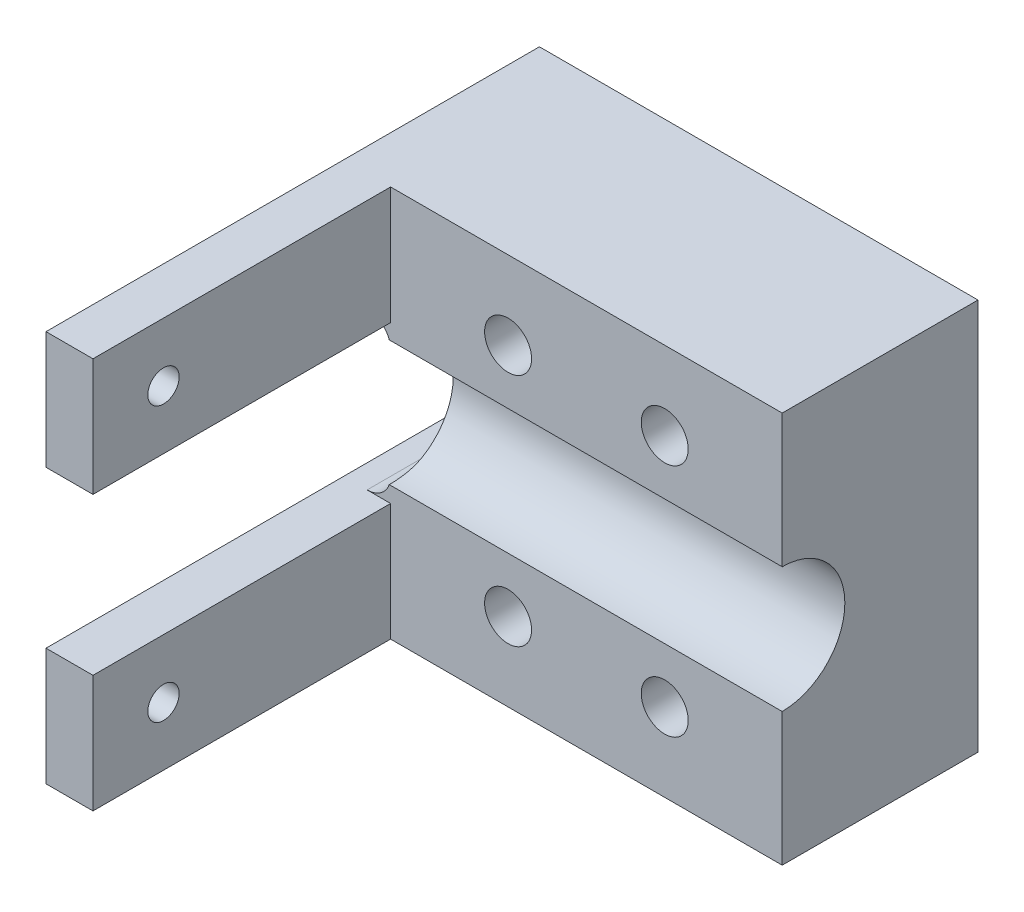
ISO-10303-21;
HEADER;
FILE_DESCRIPTION(('STEP AP214'),'2;1');
FILE_NAME('part.step','',(''),(''),'','','');
FILE_SCHEMA(('AUTOMOTIVE_DESIGN { 1 0 10303 214 1 1 1 1 }'));
ENDSEC;
DATA;
#1=APPLICATION_CONTEXT('core data for automotive mechanical design processes');
#2=APPLICATION_PROTOCOL_DEFINITION('international standard','automotive_design',2000,#1);
#3=PRODUCT_CONTEXT('',#1,'mechanical');
#4=PRODUCT('Part','Part','',(#3));
#5=PRODUCT_RELATED_PRODUCT_CATEGORY('part','',(#4));
#6=PRODUCT_DEFINITION_FORMATION('','',#4);
#7=PRODUCT_DEFINITION_CONTEXT('part definition',#1,'design');
#8=PRODUCT_DEFINITION('design','',#6,#7);
#9=PRODUCT_DEFINITION_SHAPE('','',#8);
#10=(LENGTH_UNIT() NAMED_UNIT(*) SI_UNIT(.MILLI.,.METRE.));
#11=(NAMED_UNIT(*) PLANE_ANGLE_UNIT() SI_UNIT($,.RADIAN.));
#12=(NAMED_UNIT(*) SI_UNIT($,.STERADIAN.) SOLID_ANGLE_UNIT());
#13=UNCERTAINTY_MEASURE_WITH_UNIT(LENGTH_MEASURE(1.E-05),#10,'distance_accuracy_value','');
#14=(GEOMETRIC_REPRESENTATION_CONTEXT(3) GLOBAL_UNCERTAINTY_ASSIGNED_CONTEXT((#13)) GLOBAL_UNIT_ASSIGNED_CONTEXT((#10,
#11,#12)) REPRESENTATION_CONTEXT('',''));
#15=CARTESIAN_POINT('',(0.,0.,0.));
#16=DIRECTION('',(0.,0.,1.));
#17=DIRECTION('',(1.,0.,0.));
#18=AXIS2_PLACEMENT_3D('',#15,#16,#17);
#19=CARTESIAN_POINT('',(0.,0.,25.));
#20=DIRECTION('',(1.,0.,0.));
#21=DIRECTION('',(0.,0.,-1.));
#22=AXIS2_PLACEMENT_3D('',#19,#20,#21);
#23=PLANE('',#22);
#24=DIRECTION('',(0.,-1.,0.));
#25=VECTOR('',#24,1.);
#26=CARTESIAN_POINT('',(0.,0.,0.));
#27=LINE('',#26,#25);
#28=CARTESIAN_POINT('',(0.,32.,0.));
#29=VERTEX_POINT('',#28);
#30=CARTESIAN_POINT('',(0.,18.,0.));
#31=VERTEX_POINT('',#30);
#32=EDGE_CURVE('E158',#29,#31,#27,.T.);
#33=ORIENTED_EDGE('',*,*,#32,.T.);
#34=DIRECTION('',(0.,0.,-1.));
#35=VECTOR('',#34,1.);
#36=CARTESIAN_POINT('',(0.,18.,25.));
#37=LINE('',#36,#35);
#38=CARTESIAN_POINT('',(0.,18.,21.1270166537926));
#39=VERTEX_POINT('',#38);
#40=EDGE_CURVE('E292',#31,#39,#37,.F.);
#41=ORIENTED_EDGE('',*,*,#40,.T.);
#42=CARTESIAN_POINT('',(0.,25.,25.));
#43=DIRECTION('',(-1.,0.,0.));
#44=DIRECTION('',(0.,0.,1.));
#45=AXIS2_PLACEMENT_3D('',#42,#43,#44);
#46=CIRCLE('',#45,8.);
#47=CARTESIAN_POINT('',(0.,32.,21.1270166537926));
#48=VERTEX_POINT('',#47);
#49=EDGE_CURVE('E242',#48,#39,#46,.T.);
#50=ORIENTED_EDGE('',*,*,#49,.F.);
#51=DIRECTION('',(0.,0.,1.));
#52=VECTOR('',#51,1.);
#53=CARTESIAN_POINT('',(0.,32.,0.));
#54=LINE('',#53,#52);
#55=EDGE_CURVE('E290',#48,#29,#54,.F.);
#56=ORIENTED_EDGE('',*,*,#55,.T.);
#57=EDGE_LOOP('',(#33,#41,#50,#56));
#58=FACE_BOUND('',#57,.T.);
#59=ADVANCED_FACE('F33',(#58),#23,.F.);
#60=CARTESIAN_POINT('',(0.,0.,25.));
#61=DIRECTION('',(0.,0.,-1.));
#62=DIRECTION('',(-1.,0.,0.));
#63=AXIS2_PLACEMENT_3D('',#60,#61,#62);
#64=PLANE('',#63);
#65=CARTESIAN_POINT('',(35.,10.,25.));
#66=DIRECTION('',(0.,0.,1.));
#67=DIRECTION('',(1.,0.,0.));
#68=AXIS2_PLACEMENT_3D('',#65,#66,#67);
#69=CIRCLE('',#68,3.);
#70=CARTESIAN_POINT('',(38.,10.,25.));
#71=VERTEX_POINT('',#70);
#72=EDGE_CURVE('E231',#71,#71,#69,.T.);
#73=ORIENTED_EDGE('',*,*,#72,.F.);
#74=EDGE_LOOP('',(#73));
#75=FACE_BOUND('',#74,.T.);
#76=CARTESIAN_POINT('',(15.,10.,25.));
#77=DIRECTION('',(0.,0.,1.));
#78=DIRECTION('',(1.,0.,0.));
#79=AXIS2_PLACEMENT_3D('',#76,#77,#78);
#80=CIRCLE('',#79,3.);
#81=CARTESIAN_POINT('',(18.,10.,25.));
#82=VERTEX_POINT('',#81);
#83=EDGE_CURVE('E220',#82,#82,#80,.T.);
#84=ORIENTED_EDGE('',*,*,#83,.F.);
#85=EDGE_LOOP('',(#84));
#86=FACE_BOUND('',#85,.T.);
#87=DIRECTION('',(0.,1.,0.));
#88=VECTOR('',#87,1.);
#89=CARTESIAN_POINT('',(50.,0.,25.));
#90=LINE('',#89,#88);
#91=CARTESIAN_POINT('',(50.,0.,25.));
#92=VERTEX_POINT('',#91);
#93=CARTESIAN_POINT('',(50.,17.,25.));
#94=VERTEX_POINT('',#93);
#95=EDGE_CURVE('E257',#92,#94,#90,.T.);
#96=ORIENTED_EDGE('',*,*,#95,.T.);
#97=DIRECTION('',(-1.,0.,0.));
#98=VECTOR('',#97,1.);
#99=CARTESIAN_POINT('',(58.,17.,25.));
#100=LINE('',#99,#98);
#101=CARTESIAN_POINT('',(-0.171572875253753,17.,25.));
#102=VERTEX_POINT('',#101);
#103=EDGE_CURVE('E272',#94,#102,#100,.T.);
#104=ORIENTED_EDGE('',*,*,#103,.T.);
#105=CARTESIAN_POINT('',(-3.,18.,25.));
#106=DIRECTION('',(0.,0.,-1.));
#107=DIRECTION('',(-1.,0.,0.));
#108=AXIS2_PLACEMENT_3D('',#105,#106,#107);
#109=CIRCLE('',#108,3.);
#110=CARTESIAN_POINT('',(-3.,15.,25.));
#111=VERTEX_POINT('',#110);
#112=EDGE_CURVE('E308',#102,#111,#109,.T.);
#113=ORIENTED_EDGE('',*,*,#112,.T.);
#114=DIRECTION('',(-1.,0.,0.));
#115=VECTOR('',#114,1.);
#116=CARTESIAN_POINT('',(0.,15.,25.));
#117=LINE('',#116,#115);
#118=CARTESIAN_POINT('',(0.,15.,25.));
#119=VERTEX_POINT('',#118);
#120=EDGE_CURVE('E57',#119,#111,#117,.T.);
#121=ORIENTED_EDGE('',*,*,#120,.F.);
#122=DIRECTION('',(0.,-1.,0.));
#123=VECTOR('',#122,1.);
#124=CARTESIAN_POINT('',(0.,0.,25.));
#125=LINE('',#124,#123);
#126=CARTESIAN_POINT('',(0.,0.,25.));
#127=VERTEX_POINT('',#126);
#128=EDGE_CURVE('E192',#119,#127,#125,.T.);
#129=ORIENTED_EDGE('',*,*,#128,.T.);
#130=DIRECTION('',(1.,0.,0.));
#131=VECTOR('',#130,1.);
#132=CARTESIAN_POINT('',(0.,0.,25.));
#133=LINE('',#132,#131);
#134=EDGE_CURVE('E253',#127,#92,#133,.T.);
#135=ORIENTED_EDGE('',*,*,#134,.T.);
#136=EDGE_LOOP('',(#96,#104,#113,#121,#129,#135));
#137=FACE_BOUND('',#136,.T.);
#138=ADVANCED_FACE('F330',(#75,#86,#137),#64,.F.);
#139=CARTESIAN_POINT('',(0.,0.,25.));
#140=DIRECTION('',(0.,1.,0.));
#141=DIRECTION('',(0.,0.,1.));
#142=AXIS2_PLACEMENT_3D('',#139,#140,#141);
#143=PLANE('',#142);
#144=DIRECTION('',(1.,0.,0.));
#145=VECTOR('',#144,1.);
#146=CARTESIAN_POINT('',(0.,0.,0.));
#147=LINE('',#146,#145);
#148=CARTESIAN_POINT('',(-6.,0.,0.));
#149=VERTEX_POINT('',#148);
#150=CARTESIAN_POINT('',(50.,0.,0.));
#151=VERTEX_POINT('',#150);
#152=EDGE_CURVE('E146',#149,#151,#147,.T.);
#153=ORIENTED_EDGE('',*,*,#152,.T.);
#154=DIRECTION('',(0.,0.,-1.));
#155=VECTOR('',#154,1.);
#156=CARTESIAN_POINT('',(50.,0.,25.));
#157=LINE('',#156,#155);
#158=EDGE_CURVE('E269',#92,#151,#157,.T.);
#159=ORIENTED_EDGE('',*,*,#158,.F.);
#160=ORIENTED_EDGE('',*,*,#134,.F.);
#161=DIRECTION('',(0.,0.,1.));
#162=VECTOR('',#161,1.);
#163=CARTESIAN_POINT('',(0.,0.,0.));
#164=LINE('',#163,#162);
#165=CARTESIAN_POINT('',(0.,0.,63.));
#166=VERTEX_POINT('',#165);
#167=EDGE_CURVE('E184',#127,#166,#164,.T.);
#168=ORIENTED_EDGE('',*,*,#167,.T.);
#169=DIRECTION('',(1.,0.,0.));
#170=VECTOR('',#169,1.);
#171=CARTESIAN_POINT('',(-6.,0.,63.));
#172=LINE('',#171,#170);
#173=CARTESIAN_POINT('',(-6.,0.,63.));
#174=VERTEX_POINT('',#173);
#175=EDGE_CURVE('E164',#174,#166,#172,.T.);
#176=ORIENTED_EDGE('',*,*,#175,.F.);
#177=DIRECTION('',(0.,0.,1.));
#178=VECTOR('',#177,1.);
#179=CARTESIAN_POINT('',(-6.,0.,0.));
#180=LINE('',#179,#178);
#181=EDGE_CURVE('E161',#149,#174,#180,.T.);
#182=ORIENTED_EDGE('',*,*,#181,.F.);
#183=EDGE_LOOP('',(#153,#159,#160,#168,#176,#182));
#184=FACE_BOUND('',#183,.T.);
#185=ADVANCED_FACE('F162',(#184),#143,.F.);
#186=CARTESIAN_POINT('',(50.,0.,25.));
#187=DIRECTION('',(-1.,0.,0.));
#188=DIRECTION('',(0.,0.,1.));
#189=AXIS2_PLACEMENT_3D('',#186,#187,#188);
#190=PLANE('',#189);
#191=CARTESIAN_POINT('',(50.,33.,25.));
#192=VERTEX_POINT('',#191);
#193=CARTESIAN_POINT('',(50.,50.,25.));
#194=VERTEX_POINT('',#193);
#195=EDGE_CURVE('E256',#192,#194,#90,.T.);
#196=ORIENTED_EDGE('',*,*,#195,.F.);
#197=CARTESIAN_POINT('',(50.,25.,25.));
#198=DIRECTION('',(-1.,0.,0.));
#199=DIRECTION('',(0.,0.,1.));
#200=AXIS2_PLACEMENT_3D('',#197,#198,#199);
#201=CIRCLE('',#200,8.);
#202=EDGE_CURVE('E247',#192,#94,#201,.T.);
#203=ORIENTED_EDGE('',*,*,#202,.T.);
#204=ORIENTED_EDGE('',*,*,#95,.F.);
#205=ORIENTED_EDGE('',*,*,#158,.T.);
#206=DIRECTION('',(0.,1.,0.));
#207=VECTOR('',#206,1.);
#208=CARTESIAN_POINT('',(50.,0.,0.));
#209=LINE('',#208,#207);
#210=CARTESIAN_POINT('',(50.,50.,0.));
#211=VERTEX_POINT('',#210);
#212=EDGE_CURVE('E154',#151,#211,#209,.T.);
#213=ORIENTED_EDGE('',*,*,#212,.T.);
#214=DIRECTION('',(0.,0.,-1.));
#215=VECTOR('',#214,1.);
#216=CARTESIAN_POINT('',(50.,50.,25.));
#217=LINE('',#216,#215);
#218=EDGE_CURVE('E262',#194,#211,#217,.T.);
#219=ORIENTED_EDGE('',*,*,#218,.F.);
#220=EDGE_LOOP('',(#196,#203,#204,#205,#213,#219));
#221=FACE_BOUND('',#220,.T.);
#222=ADVANCED_FACE('F334',(#221),#190,.F.);
#223=CARTESIAN_POINT('',(0.,50.,25.));
#224=DIRECTION('',(0.,-1.,0.));
#225=DIRECTION('',(0.,0.,-1.));
#226=AXIS2_PLACEMENT_3D('',#223,#224,#225);
#227=PLANE('',#226);
#228=DIRECTION('',(-1.,0.,0.));
#229=VECTOR('',#228,1.);
#230=CARTESIAN_POINT('',(0.,50.,0.));
#231=LINE('',#230,#229);
#232=CARTESIAN_POINT('',(-6.,50.,0.));
#233=VERTEX_POINT('',#232);
#234=EDGE_CURVE('E254',#211,#233,#231,.T.);
#235=ORIENTED_EDGE('',*,*,#234,.T.);
#236=DIRECTION('',(0.,0.,-1.));
#237=VECTOR('',#236,1.);
#238=CARTESIAN_POINT('',(-6.,50.,0.));
#239=LINE('',#238,#237);
#240=CARTESIAN_POINT('',(-6.,50.,63.));
#241=VERTEX_POINT('',#240);
#242=EDGE_CURVE('E203',#241,#233,#239,.T.);
#243=ORIENTED_EDGE('',*,*,#242,.F.);
#244=DIRECTION('',(1.,0.,0.));
#245=VECTOR('',#244,1.);
#246=CARTESIAN_POINT('',(-6.,50.,63.));
#247=LINE('',#246,#245);
#248=CARTESIAN_POINT('',(0.,50.,63.));
#249=VERTEX_POINT('',#248);
#250=EDGE_CURVE('E206',#241,#249,#247,.T.);
#251=ORIENTED_EDGE('',*,*,#250,.T.);
#252=DIRECTION('',(0.,0.,-1.));
#253=VECTOR('',#252,1.);
#254=CARTESIAN_POINT('',(0.,50.,0.));
#255=LINE('',#254,#253);
#256=CARTESIAN_POINT('',(0.,50.,25.));
#257=VERTEX_POINT('',#256);
#258=EDGE_CURVE('E199',#249,#257,#255,.T.);
#259=ORIENTED_EDGE('',*,*,#258,.T.);
#260=DIRECTION('',(-1.,0.,0.));
#261=VECTOR('',#260,1.);
#262=CARTESIAN_POINT('',(0.,50.,25.));
#263=LINE('',#262,#261);
#264=EDGE_CURVE('E260',#194,#257,#263,.T.);
#265=ORIENTED_EDGE('',*,*,#264,.F.);
#266=ORIENTED_EDGE('',*,*,#218,.T.);
#267=EDGE_LOOP('',(#235,#243,#251,#259,#265,#266));
#268=FACE_BOUND('',#267,.T.);
#269=ADVANCED_FACE('F337',(#268),#227,.F.);
#270=CARTESIAN_POINT('',(35.,40.,25.));
#271=DIRECTION('',(0.,0.,1.));
#272=DIRECTION('',(1.,0.,0.));
#273=AXIS2_PLACEMENT_3D('',#270,#271,#272);
#274=CIRCLE('',#273,3.);
#275=CARTESIAN_POINT('',(38.,40.,25.));
#276=VERTEX_POINT('',#275);
#277=EDGE_CURVE('E225',#276,#276,#274,.T.);
#278=ORIENTED_EDGE('',*,*,#277,.F.);
#279=EDGE_LOOP('',(#278));
#280=FACE_BOUND('',#279,.T.);
#281=CARTESIAN_POINT('',(15.,40.,25.));
#282=DIRECTION('',(0.,0.,1.));
#283=DIRECTION('',(1.,0.,0.));
#284=AXIS2_PLACEMENT_3D('',#281,#282,#283);
#285=CIRCLE('',#284,3.);
#286=CARTESIAN_POINT('',(18.,40.,25.));
#287=VERTEX_POINT('',#286);
#288=EDGE_CURVE('E224',#287,#287,#285,.T.);
#289=ORIENTED_EDGE('',*,*,#288,.F.);
#290=EDGE_LOOP('',(#289));
#291=FACE_BOUND('',#290,.T.);
#292=DIRECTION('',(0.,-1.,0.));
#293=VECTOR('',#292,1.);
#294=CARTESIAN_POINT('',(0.,0.,25.));
#295=LINE('',#294,#293);
#296=CARTESIAN_POINT('',(0.,35.,25.));
#297=VERTEX_POINT('',#296);
#298=EDGE_CURVE('E250',#257,#297,#295,.T.);
#299=ORIENTED_EDGE('',*,*,#298,.T.);
#300=DIRECTION('',(1.,0.,0.));
#301=VECTOR('',#300,1.);
#302=CARTESIAN_POINT('',(0.,35.,25.));
#303=LINE('',#302,#301);
#304=CARTESIAN_POINT('',(-3.,35.,25.));
#305=VERTEX_POINT('',#304);
#306=EDGE_CURVE('E294',#305,#297,#303,.T.);
#307=ORIENTED_EDGE('',*,*,#306,.F.);
#308=CARTESIAN_POINT('',(-3.,32.,25.));
#309=DIRECTION('',(0.,0.,-1.));
#310=DIRECTION('',(-1.,0.,0.));
#311=AXIS2_PLACEMENT_3D('',#308,#309,#310);
#312=CIRCLE('',#311,3.);
#313=CARTESIAN_POINT('',(-0.171572875253753,33.,25.));
#314=VERTEX_POINT('',#313);
#315=EDGE_CURVE('E365',#305,#314,#312,.T.);
#316=ORIENTED_EDGE('',*,*,#315,.T.);
#317=DIRECTION('',(-1.,0.,0.));
#318=VECTOR('',#317,1.);
#319=CARTESIAN_POINT('',(58.,33.,25.));
#320=LINE('',#319,#318);
#321=EDGE_CURVE('E49',#314,#192,#320,.F.);
#322=ORIENTED_EDGE('',*,*,#321,.T.);
#323=ORIENTED_EDGE('',*,*,#195,.T.);
#324=ORIENTED_EDGE('',*,*,#264,.T.);
#325=EDGE_LOOP('',(#299,#307,#316,#322,#323,#324));
#326=FACE_BOUND('',#325,.T.);
#327=ADVANCED_FACE('F341',(#280,#291,#326),#64,.F.);
#328=CARTESIAN_POINT('',(0.,0.,0.));
#329=DIRECTION('',(0.,0.,-1.));
#330=DIRECTION('',(-1.,0.,0.));
#331=AXIS2_PLACEMENT_3D('',#328,#329,#330);
#332=PLANE('',#331);
#333=CARTESIAN_POINT('',(35.,40.,0.));
#334=DIRECTION('',(0.,0.,1.));
#335=DIRECTION('',(1.,0.,0.));
#336=AXIS2_PLACEMENT_3D('',#333,#334,#335);
#337=CIRCLE('',#336,3.);
#338=CARTESIAN_POINT('',(38.,40.,0.));
#339=VERTEX_POINT('',#338);
#340=EDGE_CURVE('E221',#339,#339,#337,.T.);
#341=ORIENTED_EDGE('',*,*,#340,.T.);
#342=EDGE_LOOP('',(#341));
#343=FACE_BOUND('',#342,.T.);
#344=CARTESIAN_POINT('',(35.,10.,0.));
#345=DIRECTION('',(0.,0.,1.));
#346=DIRECTION('',(1.,0.,0.));
#347=AXIS2_PLACEMENT_3D('',#344,#345,#346);
#348=CIRCLE('',#347,3.);
#349=CARTESIAN_POINT('',(38.,10.,0.));
#350=VERTEX_POINT('',#349);
#351=EDGE_CURVE('E228',#350,#350,#348,.T.);
#352=ORIENTED_EDGE('',*,*,#351,.T.);
#353=EDGE_LOOP('',(#352));
#354=FACE_BOUND('',#353,.T.);
#355=CARTESIAN_POINT('',(15.,10.,0.));
#356=DIRECTION('',(0.,0.,1.));
#357=DIRECTION('',(1.,0.,0.));
#358=AXIS2_PLACEMENT_3D('',#355,#356,#357);
#359=CIRCLE('',#358,3.);
#360=CARTESIAN_POINT('',(18.,10.,0.));
#361=VERTEX_POINT('',#360);
#362=EDGE_CURVE('E234',#361,#361,#359,.T.);
#363=ORIENTED_EDGE('',*,*,#362,.T.);
#364=EDGE_LOOP('',(#363));
#365=FACE_BOUND('',#364,.T.);
#366=CARTESIAN_POINT('',(15.,40.,0.));
#367=DIRECTION('',(0.,0.,1.));
#368=DIRECTION('',(1.,0.,0.));
#369=AXIS2_PLACEMENT_3D('',#366,#367,#368);
#370=CIRCLE('',#369,3.);
#371=CARTESIAN_POINT('',(18.,40.,0.));
#372=VERTEX_POINT('',#371);
#373=EDGE_CURVE('E239',#372,#372,#370,.T.);
#374=ORIENTED_EDGE('',*,*,#373,.T.);
#375=EDGE_LOOP('',(#374));
#376=FACE_BOUND('',#375,.T.);
#377=ORIENTED_EDGE('',*,*,#32,.F.);
#378=CARTESIAN_POINT('',(-3.,32.,0.));
#379=DIRECTION('',(0.,0.,-1.));
#380=DIRECTION('',(-1.,0.,0.));
#381=AXIS2_PLACEMENT_3D('',#378,#379,#380);
#382=CIRCLE('',#381,3.);
#383=CARTESIAN_POINT('',(-3.,35.,0.));
#384=VERTEX_POINT('',#383);
#385=EDGE_CURVE('E11',#29,#384,#382,.F.);
#386=ORIENTED_EDGE('',*,*,#385,.T.);
#387=DIRECTION('',(1.,0.,0.));
#388=VECTOR('',#387,1.);
#389=CARTESIAN_POINT('',(-6.,35.,0.));
#390=LINE('',#389,#388);
#391=CARTESIAN_POINT('',(-6.,35.,0.));
#392=VERTEX_POINT('',#391);
#393=EDGE_CURVE('E217',#392,#384,#390,.T.);
#394=ORIENTED_EDGE('',*,*,#393,.F.);
#395=DIRECTION('',(0.,-1.,0.));
#396=VECTOR('',#395,1.);
#397=CARTESIAN_POINT('',(-6.,50.,0.));
#398=LINE('',#397,#396);
#399=EDGE_CURVE('E195',#233,#392,#398,.T.);
#400=ORIENTED_EDGE('',*,*,#399,.F.);
#401=ORIENTED_EDGE('',*,*,#234,.F.);
#402=ORIENTED_EDGE('',*,*,#212,.F.);
#403=ORIENTED_EDGE('',*,*,#152,.F.);
#404=DIRECTION('',(0.,-1.,0.));
#405=VECTOR('',#404,1.);
#406=CARTESIAN_POINT('',(-6.,0.,0.));
#407=LINE('',#406,#405);
#408=CARTESIAN_POINT('',(-6.,15.,0.));
#409=VERTEX_POINT('',#408);
#410=EDGE_CURVE('E152',#409,#149,#407,.T.);
#411=ORIENTED_EDGE('',*,*,#410,.F.);
#412=DIRECTION('',(1.,0.,0.));
#413=VECTOR('',#412,1.);
#414=CARTESIAN_POINT('',(-6.,15.,0.));
#415=LINE('',#414,#413);
#416=CARTESIAN_POINT('',(-3.,15.,0.));
#417=VERTEX_POINT('',#416);
#418=EDGE_CURVE('E183',#409,#417,#415,.T.);
#419=ORIENTED_EDGE('',*,*,#418,.T.);
#420=CARTESIAN_POINT('',(-3.,18.,0.));
#421=DIRECTION('',(0.,0.,-1.));
#422=DIRECTION('',(-1.,0.,0.));
#423=AXIS2_PLACEMENT_3D('',#420,#421,#422);
#424=CIRCLE('',#423,3.);
#425=EDGE_CURVE('E299',#417,#31,#424,.F.);
#426=ORIENTED_EDGE('',*,*,#425,.T.);
#427=EDGE_LOOP('',(#377,#386,#394,#400,#401,#402,#403,#411,#419,#426));
#428=FACE_BOUND('',#427,.T.);
#429=ADVANCED_FACE('F149',(#343,#354,#365,#376,#428),#332,.T.);
#430=CARTESIAN_POINT('',(58.,25.,25.));
#431=DIRECTION('',(-1.,0.,0.));
#432=DIRECTION('',(0.,0.,1.));
#433=AXIS2_PLACEMENT_3D('',#430,#431,#432);
#434=CYLINDRICAL_SURFACE('',#433,8.);
#435=ORIENTED_EDGE('',*,*,#202,.F.);
#436=ORIENTED_EDGE('',*,*,#321,.F.);
#437=CARTESIAN_POINT('',(-0.171572875253754,33.,25.));
#438=CARTESIAN_POINT('',(-0.171585856309354,33.0000017938301,24.8910241534674));
#439=CARTESIAN_POINT('',(-0.170785940632372,32.9977733407256,24.7820505328427));
#440=CARTESIAN_POINT('',(-0.16765517047335,32.9888697958035,24.5643125449429));
#441=CARTESIAN_POINT('',(-0.165324395498762,32.9821949349164,24.4555481670947));
#442=CARTESIAN_POINT('',(-0.159227600972294,32.9644149288414,24.2384526547431));
#443=CARTESIAN_POINT('',(-0.155461985468793,32.9533110308208,24.1301214069413));
#444=CARTESIAN_POINT('',(-0.146682590205156,32.9267005554211,23.9140585551102));
#445=CARTESIAN_POINT('',(-0.14166880840112,32.9111939708324,23.8063269520631));
#446=CARTESIAN_POINT('',(-0.125323692714573,32.8588242125467,23.488601282518));
#447=CARTESIAN_POINT('',(-0.112546762343051,32.8157458997686,23.2796749270812));
#448=CARTESIAN_POINT('',(-0.0855000210889197,32.7130898915755,22.8660730100755));
#449=CARTESIAN_POINT('',(-0.0712305250383138,32.6535156713494,22.6613965629317));
#450=CARTESIAN_POINT('',(-0.0501348457834645,32.5475517790388,22.3450002620516));
#451=CARTESIAN_POINT('',(-0.0427639938388512,32.5066454510003,22.2314547255856));
#452=CARTESIAN_POINT('',(-0.029180631211498,32.419723520608,22.0062966399235));
#453=CARTESIAN_POINT('',(-0.0229677745996056,32.3737094506701,21.8946835225207));
#454=CARTESIAN_POINT('',(-0.0123211145800007,32.2760764977337,21.672294361909));
#455=CARTESIAN_POINT('',(-0.00790878959729857,32.2243987778035,21.5615430570541));
#456=CARTESIAN_POINT('',(-0.00175335642076239,32.1159721679458,21.3424185304123));
#457=CARTESIAN_POINT('',(-1.14133695660659E-05,32.059221075824,21.2340463670094));
#458=CARTESIAN_POINT('',(0.,32.,21.1270166537926));
#459=B_SPLINE_CURVE_WITH_KNOTS('',3,(#437,#438,#439,#440,#441,#442,#443,#444,#445,#446,#447,
#448,#449,#450,#451,#452,#453,#454,#455,#456,#457,#458),.UNSPECIFIED.,.F.,.F.,(4,2,2,2,2,2,2,2,
2,2,4),(0.,0.326897982472862,0.653778988355779,0.980568013111199,1.30735757299452,
1.9477220295443,2.58795168317563,2.95058313450154,3.31310608232063,3.67983531533284,
4.04672451436599),.UNSPECIFIED.);
#460=EDGE_CURVE('E42',#314,#48,#459,.T.);
#461=ORIENTED_EDGE('',*,*,#460,.T.);
#462=ORIENTED_EDGE('',*,*,#49,.T.);
#463=CARTESIAN_POINT('',(0.,18.,21.1270166537926));
#464=CARTESIAN_POINT('',(-5.76149416167776E-06,17.9480065585232,21.2209876588311));
#465=CARTESIAN_POINT('',(-0.00135088948546018,17.8979186130831,21.3159851789415));
#466=CARTESIAN_POINT('',(-0.00617617599810697,17.8016348413248,21.5078578691991));
#467=CARTESIAN_POINT('',(-0.00965591142956468,17.7554382457848,21.6047326635772));
#468=CARTESIAN_POINT('',(-0.0224796892595929,17.62280908697,21.8978963169583));
#469=CARTESIAN_POINT('',(-0.0342090877111769,17.5422997272146,22.0967921277532));
#470=CARTESIAN_POINT('',(-0.0599301109671954,17.3990169629137,22.4961684934119));
#471=CARTESIAN_POINT('',(-0.073871628195251,17.3359201332776,22.6965371961469));
#472=CARTESIAN_POINT('',(-0.101096532875535,17.2256765580931,23.1015937816744));
#473=CARTESIAN_POINT('',(-0.114380098503015,17.1785254740095,23.3062804734958));
#474=CARTESIAN_POINT('',(-0.139840296400936,17.0934456704521,23.7559469581748));
#475=CARTESIAN_POINT('',(-0.151392507447578,17.0586814669661,24.0015771266934));
#476=CARTESIAN_POINT('',(-0.163313624691093,17.0236061082244,24.373190377179));
#477=CARTESIAN_POINT('',(-0.166387933798486,17.0147588669488,24.498339559666));
#478=CARTESIAN_POINT('',(-0.170526286934267,17.0029547128567,24.7489846918383));
#479=CARTESIAN_POINT('',(-0.171589745304295,16.999999516079,24.8744807318911));
#480=CARTESIAN_POINT('',(-0.171572875253807,17.,25.));
#481=B_SPLINE_CURVE_WITH_KNOTS('',3,(#463,#464,#465,#466,#467,#468,#469,#470,#471,#472,#473,
#474,#475,#476,#477,#478,#479,#480),.UNSPECIFIED.,.F.,.F.,(4,2,2,2,2,2,2,2,4),(0.,
0.322116178209079,0.644168531996975,1.28804201083689,1.91899765278908,2.54978148528715,
3.2935467733426,3.66991040876179,4.04638364285712),.UNSPECIFIED.);
#482=EDGE_CURVE('E301',#39,#102,#481,.T.);
#483=ORIENTED_EDGE('',*,*,#482,.T.);
#484=ORIENTED_EDGE('',*,*,#103,.F.);
#485=EDGE_LOOP('',(#435,#436,#461,#462,#483,#484));
#486=FACE_BOUND('',#485,.T.);
#487=ADVANCED_FACE('F310',(#486),#434,.F.);
#488=CARTESIAN_POINT('',(15.,40.,0.));
#489=DIRECTION('',(0.,0.,1.));
#490=DIRECTION('',(1.,0.,0.));
#491=AXIS2_PLACEMENT_3D('',#488,#489,#490);
#492=CYLINDRICAL_SURFACE('',#491,3.);
#493=ORIENTED_EDGE('',*,*,#373,.F.);
#494=EDGE_LOOP('',(#493));
#495=FACE_BOUND('',#494,.T.);
#496=ORIENTED_EDGE('',*,*,#288,.T.);
#497=EDGE_LOOP('',(#496));
#498=FACE_BOUND('',#497,.T.);
#499=ADVANCED_FACE('F430',(#495,#498),#492,.F.);
#500=CARTESIAN_POINT('',(15.,10.,0.));
#501=DIRECTION('',(0.,0.,1.));
#502=DIRECTION('',(1.,0.,0.));
#503=AXIS2_PLACEMENT_3D('',#500,#501,#502);
#504=CYLINDRICAL_SURFACE('',#503,3.);
#505=ORIENTED_EDGE('',*,*,#362,.F.);
#506=EDGE_LOOP('',(#505));
#507=FACE_BOUND('',#506,.T.);
#508=ORIENTED_EDGE('',*,*,#83,.T.);
#509=EDGE_LOOP('',(#508));
#510=FACE_BOUND('',#509,.T.);
#511=ADVANCED_FACE('F427',(#507,#510),#504,.F.);
#512=CARTESIAN_POINT('',(35.,10.,0.));
#513=DIRECTION('',(0.,0.,1.));
#514=DIRECTION('',(1.,0.,0.));
#515=AXIS2_PLACEMENT_3D('',#512,#513,#514);
#516=CYLINDRICAL_SURFACE('',#515,3.);
#517=ORIENTED_EDGE('',*,*,#351,.F.);
#518=EDGE_LOOP('',(#517));
#519=FACE_BOUND('',#518,.T.);
#520=ORIENTED_EDGE('',*,*,#72,.T.);
#521=EDGE_LOOP('',(#520));
#522=FACE_BOUND('',#521,.T.);
#523=ADVANCED_FACE('F423',(#519,#522),#516,.F.);
#524=CARTESIAN_POINT('',(35.,40.,0.));
#525=DIRECTION('',(0.,0.,1.));
#526=DIRECTION('',(1.,0.,0.));
#527=AXIS2_PLACEMENT_3D('',#524,#525,#526);
#528=CYLINDRICAL_SURFACE('',#527,3.);
#529=ORIENTED_EDGE('',*,*,#340,.F.);
#530=EDGE_LOOP('',(#529));
#531=FACE_BOUND('',#530,.T.);
#532=ORIENTED_EDGE('',*,*,#277,.T.);
#533=EDGE_LOOP('',(#532));
#534=FACE_BOUND('',#533,.T.);
#535=ADVANCED_FACE('F417',(#531,#534),#528,.F.);
#536=CARTESIAN_POINT('',(-6.,35.,0.));
#537=DIRECTION('',(0.,1.,0.));
#538=DIRECTION('',(0.,0.,1.));
#539=AXIS2_PLACEMENT_3D('',#536,#537,#538);
#540=PLANE('',#539);
#541=ORIENTED_EDGE('',*,*,#393,.T.);
#542=DIRECTION('',(0.,0.,1.));
#543=VECTOR('',#542,1.);
#544=CARTESIAN_POINT('',(-3.,35.,25.));
#545=LINE('',#544,#543);
#546=EDGE_CURVE('E296',#384,#305,#545,.T.);
#547=ORIENTED_EDGE('',*,*,#546,.T.);
#548=ORIENTED_EDGE('',*,*,#306,.T.);
#549=DIRECTION('',(0.,0.,1.));
#550=VECTOR('',#549,1.);
#551=CARTESIAN_POINT('',(0.,35.,0.));
#552=LINE('',#551,#550);
#553=CARTESIAN_POINT('',(0.,35.,63.));
#554=VERTEX_POINT('',#553);
#555=EDGE_CURVE('E194',#297,#554,#552,.T.);
#556=ORIENTED_EDGE('',*,*,#555,.T.);
#557=DIRECTION('',(1.,0.,0.));
#558=VECTOR('',#557,1.);
#559=CARTESIAN_POINT('',(-6.,35.,63.));
#560=LINE('',#559,#558);
#561=CARTESIAN_POINT('',(-6.,35.,63.));
#562=VERTEX_POINT('',#561);
#563=EDGE_CURVE('E214',#562,#554,#560,.T.);
#564=ORIENTED_EDGE('',*,*,#563,.F.);
#565=DIRECTION('',(0.,0.,1.));
#566=VECTOR('',#565,1.);
#567=CARTESIAN_POINT('',(-6.,35.,0.));
#568=LINE('',#567,#566);
#569=EDGE_CURVE('E198',#392,#562,#568,.T.);
#570=ORIENTED_EDGE('',*,*,#569,.F.);
#571=EDGE_LOOP('',(#541,#547,#548,#556,#564,#570));
#572=FACE_BOUND('',#571,.T.);
#573=ADVANCED_FACE('F392',(#572),#540,.F.);
#574=CARTESIAN_POINT('',(-6.,50.,63.));
#575=DIRECTION('',(0.,0.,-1.));
#576=DIRECTION('',(-1.,0.,0.));
#577=AXIS2_PLACEMENT_3D('',#574,#575,#576);
#578=PLANE('',#577);
#579=DIRECTION('',(0.,1.,0.));
#580=VECTOR('',#579,1.);
#581=CARTESIAN_POINT('',(0.,50.,63.));
#582=LINE('',#581,#580);
#583=EDGE_CURVE('E208',#554,#249,#582,.T.);
#584=ORIENTED_EDGE('',*,*,#583,.T.);
#585=ORIENTED_EDGE('',*,*,#250,.F.);
#586=DIRECTION('',(0.,1.,0.));
#587=VECTOR('',#586,1.);
#588=CARTESIAN_POINT('',(-6.,50.,63.));
#589=LINE('',#588,#587);
#590=EDGE_CURVE('E201',#562,#241,#589,.T.);
#591=ORIENTED_EDGE('',*,*,#590,.F.);
#592=ORIENTED_EDGE('',*,*,#563,.T.);
#593=EDGE_LOOP('',(#584,#585,#591,#592));
#594=FACE_BOUND('',#593,.T.);
#595=ADVANCED_FACE('F408',(#594),#578,.F.);
#596=CARTESIAN_POINT('',(-6.,0.,0.));
#597=DIRECTION('',(-1.,0.,0.));
#598=DIRECTION('',(0.,0.,1.));
#599=AXIS2_PLACEMENT_3D('',#596,#597,#598);
#600=PLANE('',#599);
#601=CARTESIAN_POINT('',(-6.,42.5,54.));
#602=DIRECTION('',(-1.,0.,0.));
#603=DIRECTION('',(0.,0.,1.));
#604=AXIS2_PLACEMENT_3D('',#601,#602,#603);
#605=CIRCLE('',#604,4.50000000000003);
#606=CARTESIAN_POINT('',(-6.,42.5,58.5));
#607=VERTEX_POINT('',#606);
#608=EDGE_CURVE('E283',#607,#607,#605,.F.);
#609=ORIENTED_EDGE('',*,*,#608,.T.);
#610=EDGE_LOOP('',(#609));
#611=FACE_BOUND('',#610,.T.);
#612=ORIENTED_EDGE('',*,*,#399,.T.);
#613=ORIENTED_EDGE('',*,*,#569,.T.);
#614=ORIENTED_EDGE('',*,*,#590,.T.);
#615=ORIENTED_EDGE('',*,*,#242,.T.);
#616=EDGE_LOOP('',(#612,#613,#614,#615));
#617=FACE_BOUND('',#616,.T.);
#618=ADVANCED_FACE('F396',(#611,#617),#600,.T.);
#619=CARTESIAN_POINT('',(0.,0.,0.));
#620=DIRECTION('',(-1.,0.,0.));
#621=DIRECTION('',(0.,0.,1.));
#622=AXIS2_PLACEMENT_3D('',#619,#620,#621);
#623=PLANE('',#622);
#624=CARTESIAN_POINT('',(0.,42.5,54.));
#625=DIRECTION('',(-1.,0.,0.));
#626=DIRECTION('',(0.,0.,1.));
#627=AXIS2_PLACEMENT_3D('',#624,#625,#626);
#628=CIRCLE('',#627,2.);
#629=CARTESIAN_POINT('',(0.,42.5,56.));
#630=VERTEX_POINT('',#629);
#631=EDGE_CURVE('E178',#630,#630,#628,.T.);
#632=ORIENTED_EDGE('',*,*,#631,.T.);
#633=EDGE_LOOP('',(#632));
#634=FACE_BOUND('',#633,.T.);
#635=ORIENTED_EDGE('',*,*,#298,.F.);
#636=ORIENTED_EDGE('',*,*,#258,.F.);
#637=ORIENTED_EDGE('',*,*,#583,.F.);
#638=ORIENTED_EDGE('',*,*,#555,.F.);
#639=EDGE_LOOP('',(#635,#636,#637,#638));
#640=FACE_BOUND('',#639,.T.);
#641=ADVANCED_FACE('F405',(#634,#640),#623,.F.);
#642=CARTESIAN_POINT('',(0.,0.,0.));
#643=DIRECTION('',(1.,0.,0.));
#644=DIRECTION('',(0.,0.,-1.));
#645=AXIS2_PLACEMENT_3D('',#642,#643,#644);
#646=PLANE('',#645);
#647=CARTESIAN_POINT('',(0.,7.5,54.));
#648=DIRECTION('',(-1.,0.,0.));
#649=DIRECTION('',(0.,0.,1.));
#650=AXIS2_PLACEMENT_3D('',#647,#648,#649);
#651=CIRCLE('',#650,2.);
#652=CARTESIAN_POINT('',(0.,7.5,56.));
#653=VERTEX_POINT('',#652);
#654=EDGE_CURVE('E615',#653,#653,#651,.T.);
#655=ORIENTED_EDGE('',*,*,#654,.T.);
#656=EDGE_LOOP('',(#655));
#657=FACE_BOUND('',#656,.T.);
#658=ORIENTED_EDGE('',*,*,#128,.F.);
#659=DIRECTION('',(0.,0.,-1.));
#660=VECTOR('',#659,1.);
#661=CARTESIAN_POINT('',(0.,15.,0.));
#662=LINE('',#661,#660);
#663=CARTESIAN_POINT('',(0.,15.,63.));
#664=VERTEX_POINT('',#663);
#665=EDGE_CURVE('E173',#664,#119,#662,.T.);
#666=ORIENTED_EDGE('',*,*,#665,.F.);
#667=DIRECTION('',(0.,1.,0.));
#668=VECTOR('',#667,1.);
#669=CARTESIAN_POINT('',(0.,0.,63.));
#670=LINE('',#669,#668);
#671=EDGE_CURVE('E175',#166,#664,#670,.T.);
#672=ORIENTED_EDGE('',*,*,#671,.F.);
#673=ORIENTED_EDGE('',*,*,#167,.F.);
#674=EDGE_LOOP('',(#658,#666,#672,#673));
#675=FACE_BOUND('',#674,.T.);
#676=ADVANCED_FACE('F387',(#657,#675),#646,.T.);
#677=CARTESIAN_POINT('',(-6.,0.,63.));
#678=DIRECTION('',(0.,0.,-1.));
#679=DIRECTION('',(-1.,0.,0.));
#680=AXIS2_PLACEMENT_3D('',#677,#678,#679);
#681=PLANE('',#680);
#682=ORIENTED_EDGE('',*,*,#671,.T.);
#683=DIRECTION('',(1.,0.,0.));
#684=VECTOR('',#683,1.);
#685=CARTESIAN_POINT('',(-6.,15.,63.));
#686=LINE('',#685,#684);
#687=CARTESIAN_POINT('',(-6.,15.,63.));
#688=VERTEX_POINT('',#687);
#689=EDGE_CURVE('E188',#688,#664,#686,.T.);
#690=ORIENTED_EDGE('',*,*,#689,.F.);
#691=DIRECTION('',(0.,1.,0.));
#692=VECTOR('',#691,1.);
#693=CARTESIAN_POINT('',(-6.,0.,63.));
#694=LINE('',#693,#692);
#695=EDGE_CURVE('E167',#174,#688,#694,.T.);
#696=ORIENTED_EDGE('',*,*,#695,.F.);
#697=ORIENTED_EDGE('',*,*,#175,.T.);
#698=EDGE_LOOP('',(#682,#690,#696,#697));
#699=FACE_BOUND('',#698,.T.);
#700=ADVANCED_FACE('F389',(#699),#681,.F.);
#701=CARTESIAN_POINT('',(-6.,15.,0.));
#702=DIRECTION('',(0.,-1.,0.));
#703=DIRECTION('',(0.,0.,-1.));
#704=AXIS2_PLACEMENT_3D('',#701,#702,#703);
#705=PLANE('',#704);
#706=ORIENTED_EDGE('',*,*,#120,.T.);
#707=DIRECTION('',(0.,0.,-1.));
#708=VECTOR('',#707,1.);
#709=CARTESIAN_POINT('',(-3.,15.,0.));
#710=LINE('',#709,#708);
#711=EDGE_CURVE('E287',#111,#417,#710,.T.);
#712=ORIENTED_EDGE('',*,*,#711,.T.);
#713=ORIENTED_EDGE('',*,*,#418,.F.);
#714=DIRECTION('',(0.,0.,-1.));
#715=VECTOR('',#714,1.);
#716=CARTESIAN_POINT('',(-6.,15.,0.));
#717=LINE('',#716,#715);
#718=EDGE_CURVE('E171',#688,#409,#717,.T.);
#719=ORIENTED_EDGE('',*,*,#718,.F.);
#720=ORIENTED_EDGE('',*,*,#689,.T.);
#721=ORIENTED_EDGE('',*,*,#665,.T.);
#722=EDGE_LOOP('',(#706,#712,#713,#719,#720,#721));
#723=FACE_BOUND('',#722,.T.);
#724=ADVANCED_FACE('F380',(#723),#705,.F.);
#725=CARTESIAN_POINT('',(-6.,0.,0.));
#726=DIRECTION('',(1.,0.,0.));
#727=DIRECTION('',(0.,0.,-1.));
#728=AXIS2_PLACEMENT_3D('',#725,#726,#727);
#729=PLANE('',#728);
#730=CARTESIAN_POINT('',(-6.,7.5,54.));
#731=DIRECTION('',(1.,0.,0.));
#732=DIRECTION('',(0.,0.,-1.));
#733=AXIS2_PLACEMENT_3D('',#730,#731,#732);
#734=CIRCLE('',#733,4.50000000000003);
#735=CARTESIAN_POINT('',(-6.,7.5,49.5));
#736=VERTEX_POINT('',#735);
#737=EDGE_CURVE('E277',#736,#736,#734,.T.);
#738=ORIENTED_EDGE('',*,*,#737,.T.);
#739=EDGE_LOOP('',(#738));
#740=FACE_BOUND('',#739,.T.);
#741=ORIENTED_EDGE('',*,*,#410,.T.);
#742=ORIENTED_EDGE('',*,*,#181,.T.);
#743=ORIENTED_EDGE('',*,*,#695,.T.);
#744=ORIENTED_EDGE('',*,*,#718,.T.);
#745=EDGE_LOOP('',(#741,#742,#743,#744));
#746=FACE_BOUND('',#745,.T.);
#747=ADVANCED_FACE('F169',(#740,#746),#729,.F.);
#748=CARTESIAN_POINT('',(0.,42.5,54.));
#749=DIRECTION('',(-1.,0.,0.));
#750=DIRECTION('',(0.,0.,1.));
#751=AXIS2_PLACEMENT_3D('',#748,#749,#750);
#752=CYLINDRICAL_SURFACE('',#751,2.);
#753=CARTESIAN_POINT('',(-3.49999999999998,42.5,54.));
#754=DIRECTION('',(-1.,0.,0.));
#755=DIRECTION('',(0.,0.,1.));
#756=AXIS2_PLACEMENT_3D('',#753,#754,#755);
#757=CIRCLE('',#756,2.);
#758=CARTESIAN_POINT('',(-3.49999999999998,42.5,56.));
#759=VERTEX_POINT('',#758);
#760=EDGE_CURVE('E280',#759,#759,#757,.T.);
#761=ORIENTED_EDGE('',*,*,#760,.T.);
#762=EDGE_LOOP('',(#761));
#763=FACE_BOUND('',#762,.T.);
#764=ORIENTED_EDGE('',*,*,#631,.F.);
#765=EDGE_LOOP('',(#764));
#766=FACE_BOUND('',#765,.T.);
#767=ADVANCED_FACE('F491',(#763,#766),#752,.F.);
#768=CARTESIAN_POINT('',(0.,7.5,54.));
#769=DIRECTION('',(-1.,0.,0.));
#770=DIRECTION('',(0.,0.,1.));
#771=AXIS2_PLACEMENT_3D('',#768,#769,#770);
#772=CYLINDRICAL_SURFACE('',#771,2.);
#773=CARTESIAN_POINT('',(-3.49999999999998,7.5,54.));
#774=DIRECTION('',(1.,0.,0.));
#775=DIRECTION('',(0.,0.,-1.));
#776=AXIS2_PLACEMENT_3D('',#773,#774,#775);
#777=CIRCLE('',#776,2.);
#778=CARTESIAN_POINT('',(-3.49999999999998,7.5,52.));
#779=VERTEX_POINT('',#778);
#780=EDGE_CURVE('E274',#779,#779,#777,.F.);
#781=ORIENTED_EDGE('',*,*,#780,.T.);
#782=EDGE_LOOP('',(#781));
#783=FACE_BOUND('',#782,.T.);
#784=ORIENTED_EDGE('',*,*,#654,.F.);
#785=EDGE_LOOP('',(#784));
#786=FACE_BOUND('',#785,.T.);
#787=ADVANCED_FACE('F326',(#783,#786),#772,.F.);
#788=CARTESIAN_POINT('',(-3.49999999999998,7.5,54.));
#789=DIRECTION('',(-1.,0.,0.));
#790=DIRECTION('',(0.,0.,1.));
#791=AXIS2_PLACEMENT_3D('',#788,#789,#790);
#792=CONICAL_SURFACE('',#791,2.,0.78539816339745);
#793=ORIENTED_EDGE('',*,*,#737,.F.);
#794=EDGE_LOOP('',(#793));
#795=FACE_BOUND('',#794,.T.);
#796=ORIENTED_EDGE('',*,*,#780,.F.);
#797=EDGE_LOOP('',(#796));
#798=FACE_BOUND('',#797,.T.);
#799=ADVANCED_FACE('F322',(#795,#798),#792,.F.);
#800=CARTESIAN_POINT('',(-3.49999999999998,42.5,54.));
#801=DIRECTION('',(-1.,0.,0.));
#802=DIRECTION('',(0.,0.,1.));
#803=AXIS2_PLACEMENT_3D('',#800,#801,#802);
#804=CONICAL_SURFACE('',#803,2.,0.78539816339745);
#805=ORIENTED_EDGE('',*,*,#608,.F.);
#806=EDGE_LOOP('',(#805));
#807=FACE_BOUND('',#806,.T.);
#808=ORIENTED_EDGE('',*,*,#760,.F.);
#809=EDGE_LOOP('',(#808));
#810=FACE_BOUND('',#809,.T.);
#811=ADVANCED_FACE('F318',(#807,#810),#804,.F.);
#812=CARTESIAN_POINT('',(-3.,18.,0.));
#813=DIRECTION('',(0.,0.,1.));
#814=DIRECTION('',(1.,0.,0.));
#815=AXIS2_PLACEMENT_3D('',#812,#813,#814);
#816=CYLINDRICAL_SURFACE('',#815,3.);
#817=ORIENTED_EDGE('',*,*,#482,.F.);
#818=ORIENTED_EDGE('',*,*,#40,.F.);
#819=ORIENTED_EDGE('',*,*,#425,.F.);
#820=ORIENTED_EDGE('',*,*,#711,.F.);
#821=ORIENTED_EDGE('',*,*,#112,.F.);
#822=EDGE_LOOP('',(#817,#818,#819,#820,#821));
#823=FACE_BOUND('',#822,.T.);
#824=ADVANCED_FACE('F314',(#823),#816,.F.);
#825=CARTESIAN_POINT('',(-3.,32.,0.));
#826=DIRECTION('',(0.,0.,-1.));
#827=DIRECTION('',(-1.,0.,0.));
#828=AXIS2_PLACEMENT_3D('',#825,#826,#827);
#829=CYLINDRICAL_SURFACE('',#828,3.);
#830=ORIENTED_EDGE('',*,*,#385,.F.);
#831=ORIENTED_EDGE('',*,*,#55,.F.);
#832=ORIENTED_EDGE('',*,*,#460,.F.);
#833=ORIENTED_EDGE('',*,*,#315,.F.);
#834=ORIENTED_EDGE('',*,*,#546,.F.);
#835=EDGE_LOOP('',(#830,#831,#832,#833,#834));
#836=FACE_BOUND('',#835,.T.);
#837=ADVANCED_FACE('F35',(#836),#829,.F.);
#838=CLOSED_SHELL('',(#59,#138,#185,#222,#269,#327,#429,#487,#499,#511,#523,#535,#573,#595,#618,
#641,#676,#700,#724,#747,#767,#787,#799,#811,#824,#837));
#839=MANIFOLD_SOLID_BREP('B2',#838);
#840=ADVANCED_BREP_SHAPE_REPRESENTATION('',(#18,#839),#14);
#841=SHAPE_DEFINITION_REPRESENTATION(#9,#840);
ENDSEC;
END-ISO-10303-21;
